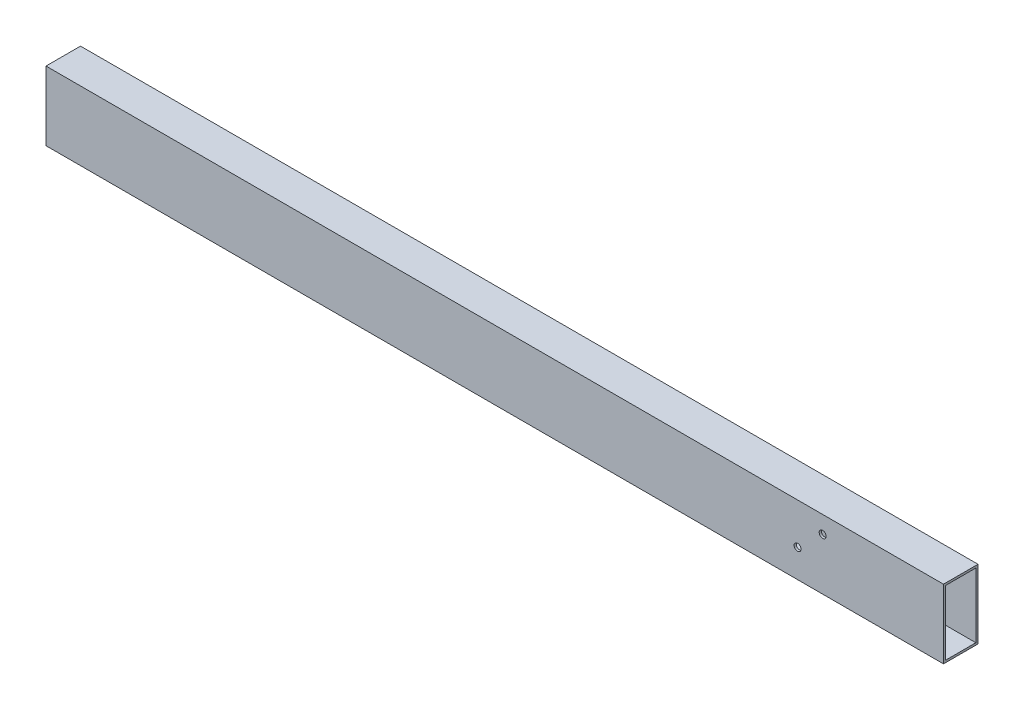
ISO-10303-21;
HEADER;
FILE_DESCRIPTION(('STEP AP214'),'2;1');
FILE_NAME('part.step','',(''),(''),'','','');
FILE_SCHEMA(('AUTOMOTIVE_DESIGN { 1 0 10303 214 1 1 1 1 }'));
ENDSEC;
DATA;
#1=APPLICATION_CONTEXT('core data for automotive mechanical design processes');
#2=APPLICATION_PROTOCOL_DEFINITION('international standard','automotive_design',2000,#1);
#3=PRODUCT_CONTEXT('',#1,'mechanical');
#4=PRODUCT('Part','Part','',(#3));
#5=PRODUCT_RELATED_PRODUCT_CATEGORY('part','',(#4));
#6=PRODUCT_DEFINITION_FORMATION('','',#4);
#7=PRODUCT_DEFINITION_CONTEXT('part definition',#1,'design');
#8=PRODUCT_DEFINITION('design','',#6,#7);
#9=PRODUCT_DEFINITION_SHAPE('','',#8);
#10=(LENGTH_UNIT() NAMED_UNIT(*) SI_UNIT(.MILLI.,.METRE.));
#11=(NAMED_UNIT(*) PLANE_ANGLE_UNIT() SI_UNIT($,.RADIAN.));
#12=(NAMED_UNIT(*) SI_UNIT($,.STERADIAN.) SOLID_ANGLE_UNIT());
#13=UNCERTAINTY_MEASURE_WITH_UNIT(LENGTH_MEASURE(1.E-05),#10,'distance_accuracy_value','');
#14=(GEOMETRIC_REPRESENTATION_CONTEXT(3) GLOBAL_UNCERTAINTY_ASSIGNED_CONTEXT((#13)) GLOBAL_UNIT_ASSIGNED_CONTEXT((#10,
#11,#12)) REPRESENTATION_CONTEXT('',''));
#15=CARTESIAN_POINT('',(0.,0.,0.));
#16=DIRECTION('',(0.,0.,1.));
#17=DIRECTION('',(1.,0.,0.));
#18=AXIS2_PLACEMENT_3D('',#15,#16,#17);
#19=CARTESIAN_POINT('',(330.2,0.,0.));
#20=DIRECTION('',(-1.,0.,0.));
#21=DIRECTION('',(0.,0.,1.));
#22=AXIS2_PLACEMENT_3D('',#19,#20,#21);
#23=PLANE('',#22);
#24=DIRECTION('',(0.,1.,0.));
#25=VECTOR('',#24,1.);
#26=CARTESIAN_POINT('',(330.2,-25.4,-14.6230032064473));
#27=LINE('',#26,#25);
#28=CARTESIAN_POINT('',(330.2,-25.4,-14.6230032064473));
#29=VERTEX_POINT('',#28);
#30=CARTESIAN_POINT('',(330.2,25.4,-14.6230032064473));
#31=VERTEX_POINT('',#30);
#32=EDGE_CURVE('E155',#29,#31,#27,.T.);
#33=ORIENTED_EDGE('',*,*,#32,.T.);
#34=DIRECTION('',(0.,0.,1.));
#35=VECTOR('',#34,1.);
#36=CARTESIAN_POINT('',(330.2,25.4,10.7769967935527));
#37=LINE('',#36,#35);
#38=CARTESIAN_POINT('',(330.2,25.4,10.7769967935527));
#39=VERTEX_POINT('',#38);
#40=EDGE_CURVE('E159',#31,#39,#37,.T.);
#41=ORIENTED_EDGE('',*,*,#40,.T.);
#42=DIRECTION('',(0.,-1.,0.));
#43=VECTOR('',#42,1.);
#44=CARTESIAN_POINT('',(330.2,-25.4,10.7769967935527));
#45=LINE('',#44,#43);
#46=CARTESIAN_POINT('',(330.2,-25.4,10.7769967935527));
#47=VERTEX_POINT('',#46);
#48=EDGE_CURVE('E163',#39,#47,#45,.T.);
#49=ORIENTED_EDGE('',*,*,#48,.T.);
#50=DIRECTION('',(0.,0.,-1.));
#51=VECTOR('',#50,1.);
#52=CARTESIAN_POINT('',(330.2,-25.4,10.7769967935527));
#53=LINE('',#52,#51);
#54=EDGE_CURVE('E166',#47,#29,#53,.T.);
#55=ORIENTED_EDGE('',*,*,#54,.T.);
#56=EDGE_LOOP('',(#33,#41,#49,#55));
#57=FACE_BOUND('',#56,.T.);
#58=DIRECTION('',(0.,0.,-1.));
#59=VECTOR('',#58,1.);
#60=CARTESIAN_POINT('',(330.2,-23.8125,9.18949679355275));
#61=LINE('',#60,#59);
#62=CARTESIAN_POINT('',(330.2,-23.8125,9.18949679355275));
#63=VERTEX_POINT('',#62);
#64=CARTESIAN_POINT('',(330.2,-23.8125,-13.0355032064473));
#65=VERTEX_POINT('',#64);
#66=EDGE_CURVE('E105',#63,#65,#61,.T.);
#67=ORIENTED_EDGE('',*,*,#66,.F.);
#68=DIRECTION('',(0.,-1.,0.));
#69=VECTOR('',#68,1.);
#70=CARTESIAN_POINT('',(330.2,-23.8125,9.18949679355275));
#71=LINE('',#70,#69);
#72=CARTESIAN_POINT('',(330.2,23.8125,9.18949679355275));
#73=VERTEX_POINT('',#72);
#74=EDGE_CURVE('E131',#73,#63,#71,.T.);
#75=ORIENTED_EDGE('',*,*,#74,.F.);
#76=DIRECTION('',(0.,0.,1.));
#77=VECTOR('',#76,1.);
#78=CARTESIAN_POINT('',(330.2,23.8125,9.18949679355275));
#79=LINE('',#78,#77);
#80=CARTESIAN_POINT('',(330.2,23.8125,-13.0355032064473));
#81=VERTEX_POINT('',#80);
#82=EDGE_CURVE('E127',#81,#73,#79,.T.);
#83=ORIENTED_EDGE('',*,*,#82,.F.);
#84=DIRECTION('',(0.,1.,0.));
#85=VECTOR('',#84,1.);
#86=CARTESIAN_POINT('',(330.2,-23.8125,-13.0355032064473));
#87=LINE('',#86,#85);
#88=EDGE_CURVE('E114',#65,#81,#87,.T.);
#89=ORIENTED_EDGE('',*,*,#88,.F.);
#90=EDGE_LOOP('',(#67,#75,#83,#89));
#91=FACE_BOUND('',#90,.T.);
#92=ADVANCED_FACE('F39',(#57,#91),#23,.F.);
#93=CARTESIAN_POINT('',(-330.2,0.,0.));
#94=DIRECTION('',(-1.,0.,0.));
#95=DIRECTION('',(0.,0.,1.));
#96=AXIS2_PLACEMENT_3D('',#93,#94,#95);
#97=PLANE('',#96);
#98=DIRECTION('',(0.,1.,0.));
#99=VECTOR('',#98,1.);
#100=CARTESIAN_POINT('',(-330.2,-25.4,-14.6230032064473));
#101=LINE('',#100,#99);
#102=CARTESIAN_POINT('',(-330.2,-25.4,-14.6230032064473));
#103=VERTEX_POINT('',#102);
#104=CARTESIAN_POINT('',(-330.2,25.4,-14.6230032064473));
#105=VERTEX_POINT('',#104);
#106=EDGE_CURVE('E123',#103,#105,#101,.T.);
#107=ORIENTED_EDGE('',*,*,#106,.F.);
#108=DIRECTION('',(0.,0.,-1.));
#109=VECTOR('',#108,1.);
#110=CARTESIAN_POINT('',(-330.2,-25.4,10.7769967935527));
#111=LINE('',#110,#109);
#112=CARTESIAN_POINT('',(-330.2,-25.4,10.7769967935527));
#113=VERTEX_POINT('',#112);
#114=EDGE_CURVE('E160',#113,#103,#111,.T.);
#115=ORIENTED_EDGE('',*,*,#114,.F.);
#116=DIRECTION('',(0.,-1.,0.));
#117=VECTOR('',#116,1.);
#118=CARTESIAN_POINT('',(-330.2,-25.4,10.7769967935527));
#119=LINE('',#118,#117);
#120=CARTESIAN_POINT('',(-330.2,25.4,10.7769967935527));
#121=VERTEX_POINT('',#120);
#122=EDGE_CURVE('E176',#121,#113,#119,.T.);
#123=ORIENTED_EDGE('',*,*,#122,.F.);
#124=DIRECTION('',(0.,0.,1.));
#125=VECTOR('',#124,1.);
#126=CARTESIAN_POINT('',(-330.2,25.4,10.7769967935527));
#127=LINE('',#126,#125);
#128=EDGE_CURVE('E173',#105,#121,#127,.T.);
#129=ORIENTED_EDGE('',*,*,#128,.F.);
#130=EDGE_LOOP('',(#107,#115,#123,#129));
#131=FACE_BOUND('',#130,.T.);
#132=DIRECTION('',(0.,-1.,0.));
#133=VECTOR('',#132,1.);
#134=CARTESIAN_POINT('',(-330.2,-23.8125,9.18949679355275));
#135=LINE('',#134,#133);
#136=CARTESIAN_POINT('',(-330.2,23.8125,9.18949679355275));
#137=VERTEX_POINT('',#136);
#138=CARTESIAN_POINT('',(-330.2,-23.8125,9.18949679355275));
#139=VERTEX_POINT('',#138);
#140=EDGE_CURVE('E115',#137,#139,#135,.T.);
#141=ORIENTED_EDGE('',*,*,#140,.T.);
#142=DIRECTION('',(0.,0.,-1.));
#143=VECTOR('',#142,1.);
#144=CARTESIAN_POINT('',(-330.2,-23.8125,9.18949679355275));
#145=LINE('',#144,#143);
#146=CARTESIAN_POINT('',(-330.2,-23.8125,-13.0355032064473));
#147=VERTEX_POINT('',#146);
#148=EDGE_CURVE('E63',#139,#147,#145,.T.);
#149=ORIENTED_EDGE('',*,*,#148,.T.);
#150=DIRECTION('',(0.,1.,0.));
#151=VECTOR('',#150,1.);
#152=CARTESIAN_POINT('',(-330.2,-23.8125,-13.0355032064473));
#153=LINE('',#152,#151);
#154=CARTESIAN_POINT('',(-330.2,23.8125,-13.0355032064473));
#155=VERTEX_POINT('',#154);
#156=EDGE_CURVE('E121',#147,#155,#153,.T.);
#157=ORIENTED_EDGE('',*,*,#156,.T.);
#158=DIRECTION('',(0.,0.,1.));
#159=VECTOR('',#158,1.);
#160=CARTESIAN_POINT('',(-330.2,23.8125,9.18949679355275));
#161=LINE('',#160,#159);
#162=EDGE_CURVE('E142',#155,#137,#161,.T.);
#163=ORIENTED_EDGE('',*,*,#162,.T.);
#164=EDGE_LOOP('',(#141,#149,#157,#163));
#165=FACE_BOUND('',#164,.T.);
#166=ADVANCED_FACE('F199',(#131,#165),#97,.T.);
#167=CARTESIAN_POINT('',(330.2,-25.4,-14.6230032064473));
#168=DIRECTION('',(0.,0.,1.));
#169=DIRECTION('',(1.,0.,0.));
#170=AXIS2_PLACEMENT_3D('',#167,#168,#169);
#171=PLANE('',#170);
#172=CARTESIAN_POINT('',(241.3,12.7,-14.6230032064473));
#173=DIRECTION('',(0.,0.,-1.));
#174=DIRECTION('',(-1.,0.,0.));
#175=AXIS2_PLACEMENT_3D('',#172,#173,#174);
#176=CIRCLE('',#175,2.55269999999999);
#177=CARTESIAN_POINT('',(238.7473,12.7,-14.6230032064473));
#178=VERTEX_POINT('',#177);
#179=EDGE_CURVE('E269',#178,#178,#176,.T.);
#180=ORIENTED_EDGE('',*,*,#179,.F.);
#181=EDGE_LOOP('',(#180));
#182=FACE_BOUND('',#181,.T.);
#183=CARTESIAN_POINT('',(222.83227544168,-4.73855354202341,-14.6230032064473));
#184=DIRECTION('',(0.,0.,-1.));
#185=DIRECTION('',(-1.,0.,0.));
#186=AXIS2_PLACEMENT_3D('',#183,#184,#185);
#187=CIRCLE('',#186,2.55269999999999);
#188=CARTESIAN_POINT('',(220.27957544168,-4.73855354202341,-14.6230032064473));
#189=VERTEX_POINT('',#188);
#190=EDGE_CURVE('E281',#189,#189,#187,.T.);
#191=ORIENTED_EDGE('',*,*,#190,.F.);
#192=EDGE_LOOP('',(#191));
#193=FACE_BOUND('',#192,.T.);
#194=ORIENTED_EDGE('',*,*,#106,.T.);
#195=DIRECTION('',(-1.,0.,0.));
#196=VECTOR('',#195,1.);
#197=CARTESIAN_POINT('',(330.2,25.4,-14.6230032064473));
#198=LINE('',#197,#196);
#199=EDGE_CURVE('E11',#31,#105,#198,.T.);
#200=ORIENTED_EDGE('',*,*,#199,.F.);
#201=ORIENTED_EDGE('',*,*,#32,.F.);
#202=DIRECTION('',(-1.,0.,0.));
#203=VECTOR('',#202,1.);
#204=CARTESIAN_POINT('',(330.2,-25.4,-14.6230032064473));
#205=LINE('',#204,#203);
#206=EDGE_CURVE('E169',#29,#103,#205,.T.);
#207=ORIENTED_EDGE('',*,*,#206,.T.);
#208=EDGE_LOOP('',(#194,#200,#201,#207));
#209=FACE_BOUND('',#208,.T.);
#210=ADVANCED_FACE('F41',(#182,#193,#209),#171,.F.);
#211=CARTESIAN_POINT('',(330.2,25.4,10.7769967935527));
#212=DIRECTION('',(0.,-1.,0.));
#213=DIRECTION('',(0.,0.,-1.));
#214=AXIS2_PLACEMENT_3D('',#211,#212,#213);
#215=PLANE('',#214);
#216=ORIENTED_EDGE('',*,*,#128,.T.);
#217=DIRECTION('',(-1.,0.,0.));
#218=VECTOR('',#217,1.);
#219=CARTESIAN_POINT('',(330.2,25.4,10.7769967935527));
#220=LINE('',#219,#218);
#221=EDGE_CURVE('E48',#39,#121,#220,.T.);
#222=ORIENTED_EDGE('',*,*,#221,.F.);
#223=ORIENTED_EDGE('',*,*,#40,.F.);
#224=ORIENTED_EDGE('',*,*,#199,.T.);
#225=EDGE_LOOP('',(#216,#222,#223,#224));
#226=FACE_BOUND('',#225,.T.);
#227=ADVANCED_FACE('F209',(#226),#215,.F.);
#228=CARTESIAN_POINT('',(330.2,-25.4,10.7769967935527));
#229=DIRECTION('',(0.,0.,-1.));
#230=DIRECTION('',(-1.,0.,0.));
#231=AXIS2_PLACEMENT_3D('',#228,#229,#230);
#232=PLANE('',#231);
#233=CARTESIAN_POINT('',(241.3,12.7,10.7769967935527));
#234=DIRECTION('',(0.,0.,-1.));
#235=DIRECTION('',(-1.,0.,0.));
#236=AXIS2_PLACEMENT_3D('',#233,#234,#235);
#237=CIRCLE('',#236,2.55269999999999);
#238=CARTESIAN_POINT('',(238.7473,12.7,10.7769967935527));
#239=VERTEX_POINT('',#238);
#240=EDGE_CURVE('E267',#239,#239,#237,.T.);
#241=ORIENTED_EDGE('',*,*,#240,.T.);
#242=EDGE_LOOP('',(#241));
#243=FACE_BOUND('',#242,.T.);
#244=CARTESIAN_POINT('',(222.83227544168,-4.73855354202341,10.7769967935527));
#245=DIRECTION('',(0.,0.,-1.));
#246=DIRECTION('',(-1.,0.,0.));
#247=AXIS2_PLACEMENT_3D('',#244,#245,#246);
#248=CIRCLE('',#247,2.55269999999999);
#249=CARTESIAN_POINT('',(220.27957544168,-4.73855354202341,10.7769967935527));
#250=VERTEX_POINT('',#249);
#251=EDGE_CURVE('E285',#250,#250,#248,.T.);
#252=ORIENTED_EDGE('',*,*,#251,.T.);
#253=EDGE_LOOP('',(#252));
#254=FACE_BOUND('',#253,.T.);
#255=ORIENTED_EDGE('',*,*,#122,.T.);
#256=DIRECTION('',(-1.,0.,0.));
#257=VECTOR('',#256,1.);
#258=CARTESIAN_POINT('',(330.2,-25.4,10.7769967935527));
#259=LINE('',#258,#257);
#260=EDGE_CURVE('E184',#47,#113,#259,.T.);
#261=ORIENTED_EDGE('',*,*,#260,.F.);
#262=ORIENTED_EDGE('',*,*,#48,.F.);
#263=ORIENTED_EDGE('',*,*,#221,.T.);
#264=EDGE_LOOP('',(#255,#261,#262,#263));
#265=FACE_BOUND('',#264,.T.);
#266=ADVANCED_FACE('F193',(#243,#254,#265),#232,.F.);
#267=CARTESIAN_POINT('',(330.2,-25.4,10.7769967935527));
#268=DIRECTION('',(0.,1.,0.));
#269=DIRECTION('',(0.,0.,1.));
#270=AXIS2_PLACEMENT_3D('',#267,#268,#269);
#271=PLANE('',#270);
#272=ORIENTED_EDGE('',*,*,#114,.T.);
#273=ORIENTED_EDGE('',*,*,#206,.F.);
#274=ORIENTED_EDGE('',*,*,#54,.F.);
#275=ORIENTED_EDGE('',*,*,#260,.T.);
#276=EDGE_LOOP('',(#272,#273,#274,#275));
#277=FACE_BOUND('',#276,.T.);
#278=ADVANCED_FACE('F203',(#277),#271,.F.);
#279=CARTESIAN_POINT('',(330.2,-23.8125,9.18949679355275));
#280=DIRECTION('',(0.,1.,0.));
#281=DIRECTION('',(0.,0.,1.));
#282=AXIS2_PLACEMENT_3D('',#279,#280,#281);
#283=PLANE('',#282);
#284=ORIENTED_EDGE('',*,*,#148,.F.);
#285=DIRECTION('',(-1.,0.,0.));
#286=VECTOR('',#285,1.);
#287=CARTESIAN_POINT('',(330.2,-23.8125,9.18949679355275));
#288=LINE('',#287,#286);
#289=EDGE_CURVE('E109',#63,#139,#288,.T.);
#290=ORIENTED_EDGE('',*,*,#289,.F.);
#291=ORIENTED_EDGE('',*,*,#66,.T.);
#292=DIRECTION('',(-1.,0.,0.));
#293=VECTOR('',#292,1.);
#294=CARTESIAN_POINT('',(330.2,-23.8125,-13.0355032064473));
#295=LINE('',#294,#293);
#296=EDGE_CURVE('E108',#65,#147,#295,.T.);
#297=ORIENTED_EDGE('',*,*,#296,.T.);
#298=EDGE_LOOP('',(#284,#290,#291,#297));
#299=FACE_BOUND('',#298,.T.);
#300=ADVANCED_FACE('F107',(#299),#283,.T.);
#301=CARTESIAN_POINT('',(330.2,-23.8125,-13.0355032064473));
#302=DIRECTION('',(0.,0.,1.));
#303=DIRECTION('',(0.,-1.,0.));
#304=AXIS2_PLACEMENT_3D('',#301,#302,#303);
#305=PLANE('',#304);
#306=CARTESIAN_POINT('',(241.3,12.7,-13.0355032064473));
#307=DIRECTION('',(0.,0.,1.));
#308=DIRECTION('',(0.,-1.,0.));
#309=AXIS2_PLACEMENT_3D('',#306,#307,#308);
#310=CIRCLE('',#309,2.55269999999999);
#311=CARTESIAN_POINT('',(241.3,10.1473,-13.0355032064473));
#312=VERTEX_POINT('',#311);
#313=EDGE_CURVE('E273',#312,#312,#310,.T.);
#314=ORIENTED_EDGE('',*,*,#313,.F.);
#315=EDGE_LOOP('',(#314));
#316=FACE_BOUND('',#315,.T.);
#317=CARTESIAN_POINT('',(222.83227544168,-4.73855354202341,-13.0355032064473));
#318=DIRECTION('',(0.,0.,1.));
#319=DIRECTION('',(0.,-1.,0.));
#320=AXIS2_PLACEMENT_3D('',#317,#318,#319);
#321=CIRCLE('',#320,2.55269999999999);
#322=CARTESIAN_POINT('',(222.83227544168,-7.2912535420234,-13.0355032064473));
#323=VERTEX_POINT('',#322);
#324=EDGE_CURVE('E289',#323,#323,#321,.T.);
#325=ORIENTED_EDGE('',*,*,#324,.F.);
#326=EDGE_LOOP('',(#325));
#327=FACE_BOUND('',#326,.T.);
#328=ORIENTED_EDGE('',*,*,#156,.F.);
#329=ORIENTED_EDGE('',*,*,#296,.F.);
#330=ORIENTED_EDGE('',*,*,#88,.T.);
#331=DIRECTION('',(-1.,0.,0.));
#332=VECTOR('',#331,1.);
#333=CARTESIAN_POINT('',(330.2,23.8125,-13.0355032064473));
#334=LINE('',#333,#332);
#335=EDGE_CURVE('E124',#81,#155,#334,.T.);
#336=ORIENTED_EDGE('',*,*,#335,.T.);
#337=EDGE_LOOP('',(#328,#329,#330,#336));
#338=FACE_BOUND('',#337,.T.);
#339=ADVANCED_FACE('F118',(#316,#327,#338),#305,.T.);
#340=CARTESIAN_POINT('',(330.2,23.8125,9.18949679355275));
#341=DIRECTION('',(0.,-1.,0.));
#342=DIRECTION('',(0.,0.,-1.));
#343=AXIS2_PLACEMENT_3D('',#340,#341,#342);
#344=PLANE('',#343);
#345=ORIENTED_EDGE('',*,*,#162,.F.);
#346=ORIENTED_EDGE('',*,*,#335,.F.);
#347=ORIENTED_EDGE('',*,*,#82,.T.);
#348=DIRECTION('',(-1.,0.,0.));
#349=VECTOR('',#348,1.);
#350=CARTESIAN_POINT('',(330.2,23.8125,9.18949679355275));
#351=LINE('',#350,#349);
#352=EDGE_CURVE('E55',#73,#137,#351,.T.);
#353=ORIENTED_EDGE('',*,*,#352,.T.);
#354=EDGE_LOOP('',(#345,#346,#347,#353));
#355=FACE_BOUND('',#354,.T.);
#356=ADVANCED_FACE('F234',(#355),#344,.T.);
#357=CARTESIAN_POINT('',(330.2,-23.8125,9.18949679355275));
#358=DIRECTION('',(0.,0.,-1.));
#359=DIRECTION('',(-1.,0.,0.));
#360=AXIS2_PLACEMENT_3D('',#357,#358,#359);
#361=PLANE('',#360);
#362=CARTESIAN_POINT('',(241.3,12.7,9.18949679355275));
#363=DIRECTION('',(0.,0.,-1.));
#364=DIRECTION('',(-1.,0.,0.));
#365=AXIS2_PLACEMENT_3D('',#362,#363,#364);
#366=CIRCLE('',#365,2.55269999999999);
#367=CARTESIAN_POINT('',(238.7473,12.7,9.18949679355275));
#368=VERTEX_POINT('',#367);
#369=EDGE_CURVE('E264',#368,#368,#366,.T.);
#370=ORIENTED_EDGE('',*,*,#369,.F.);
#371=EDGE_LOOP('',(#370));
#372=FACE_BOUND('',#371,.T.);
#373=CARTESIAN_POINT('',(222.83227544168,-4.73855354202341,9.18949679355275));
#374=DIRECTION('',(0.,0.,-1.));
#375=DIRECTION('',(-1.,0.,0.));
#376=AXIS2_PLACEMENT_3D('',#373,#374,#375);
#377=CIRCLE('',#376,2.55269999999999);
#378=CARTESIAN_POINT('',(220.27957544168,-4.73855354202341,9.18949679355275));
#379=VERTEX_POINT('',#378);
#380=EDGE_CURVE('E139',#379,#379,#377,.T.);
#381=ORIENTED_EDGE('',*,*,#380,.F.);
#382=EDGE_LOOP('',(#381));
#383=FACE_BOUND('',#382,.T.);
#384=ORIENTED_EDGE('',*,*,#140,.F.);
#385=ORIENTED_EDGE('',*,*,#352,.F.);
#386=ORIENTED_EDGE('',*,*,#74,.T.);
#387=ORIENTED_EDGE('',*,*,#289,.T.);
#388=EDGE_LOOP('',(#384,#385,#386,#387));
#389=FACE_BOUND('',#388,.T.);
#390=ADVANCED_FACE('F239',(#372,#383,#389),#361,.T.);
#391=CARTESIAN_POINT('',(222.83227544168,-4.73855354202341,-14.6230032064473));
#392=DIRECTION('',(0.,0.,-1.));
#393=DIRECTION('',(-1.,0.,0.));
#394=AXIS2_PLACEMENT_3D('',#391,#392,#393);
#395=CYLINDRICAL_SURFACE('',#394,2.55269999999999);
#396=ORIENTED_EDGE('',*,*,#380,.T.);
#397=EDGE_LOOP('',(#396));
#398=FACE_BOUND('',#397,.T.);
#399=ORIENTED_EDGE('',*,*,#251,.F.);
#400=EDGE_LOOP('',(#399));
#401=FACE_BOUND('',#400,.T.);
#402=ADVANCED_FACE('F247',(#398,#401),#395,.F.);
#403=ORIENTED_EDGE('',*,*,#324,.T.);
#404=EDGE_LOOP('',(#403));
#405=FACE_BOUND('',#404,.T.);
#406=ORIENTED_EDGE('',*,*,#190,.T.);
#407=EDGE_LOOP('',(#406));
#408=FACE_BOUND('',#407,.T.);
#409=ADVANCED_FACE('F249',(#405,#408),#395,.F.);
#410=CARTESIAN_POINT('',(241.3,12.7,-14.6230032064473));
#411=DIRECTION('',(0.,0.,-1.));
#412=DIRECTION('',(-1.,0.,0.));
#413=AXIS2_PLACEMENT_3D('',#410,#411,#412);
#414=CYLINDRICAL_SURFACE('',#413,2.55269999999999);
#415=ORIENTED_EDGE('',*,*,#313,.T.);
#416=EDGE_LOOP('',(#415));
#417=FACE_BOUND('',#416,.T.);
#418=ORIENTED_EDGE('',*,*,#179,.T.);
#419=EDGE_LOOP('',(#418));
#420=FACE_BOUND('',#419,.T.);
#421=ADVANCED_FACE('F252',(#417,#420),#414,.F.);
#422=ORIENTED_EDGE('',*,*,#369,.T.);
#423=EDGE_LOOP('',(#422));
#424=FACE_BOUND('',#423,.T.);
#425=ORIENTED_EDGE('',*,*,#240,.F.);
#426=EDGE_LOOP('',(#425));
#427=FACE_BOUND('',#426,.T.);
#428=ADVANCED_FACE('F254',(#424,#427),#414,.F.);
#429=CLOSED_SHELL('',(#92,#166,#210,#227,#266,#278,#300,#339,#356,#390,#402,#409,#421,#428));
#430=MANIFOLD_SOLID_BREP('B2',#429);
#431=ADVANCED_BREP_SHAPE_REPRESENTATION('',(#18,#430),#14);
#432=SHAPE_DEFINITION_REPRESENTATION(#9,#431);
ENDSEC;
END-ISO-10303-21;
